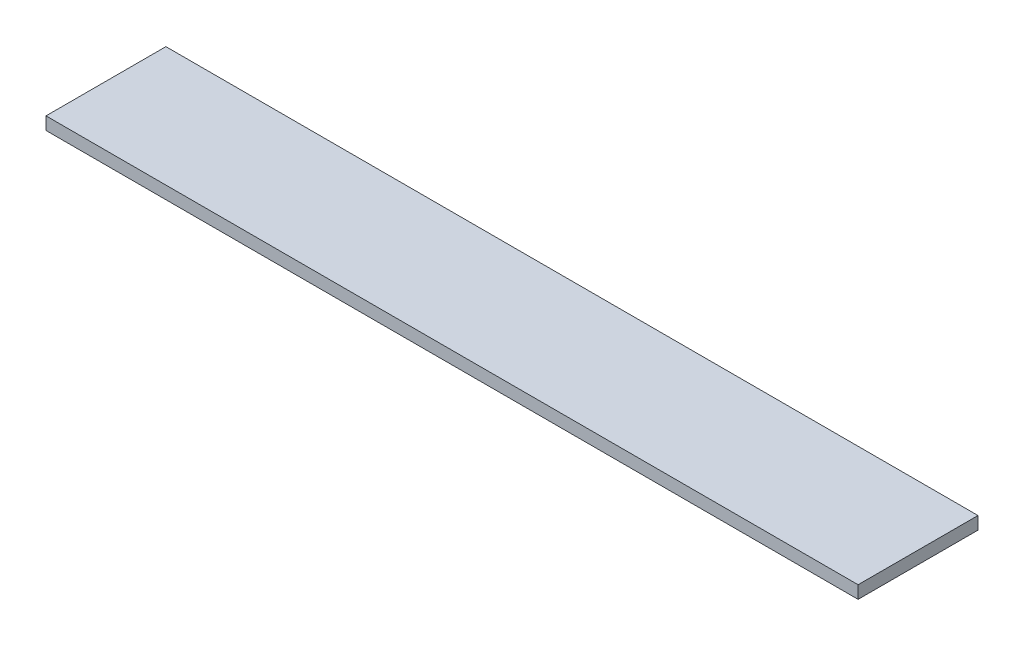
ISO-10303-21;
HEADER;
FILE_DESCRIPTION(('STEP AP214'),'2;1');
FILE_NAME('part.step','',(''),(''),'','','');
FILE_SCHEMA(('AUTOMOTIVE_DESIGN { 1 0 10303 214 1 1 1 1 }'));
ENDSEC;
DATA;
#1=APPLICATION_CONTEXT('core data for automotive mechanical design processes');
#2=APPLICATION_PROTOCOL_DEFINITION('international standard','automotive_design',2000,#1);
#3=PRODUCT_CONTEXT('',#1,'mechanical');
#4=PRODUCT('Part','Part','',(#3));
#5=PRODUCT_RELATED_PRODUCT_CATEGORY('part','',(#4));
#6=PRODUCT_DEFINITION_FORMATION('','',#4);
#7=PRODUCT_DEFINITION_CONTEXT('part definition',#1,'design');
#8=PRODUCT_DEFINITION('design','',#6,#7);
#9=PRODUCT_DEFINITION_SHAPE('','',#8);
#10=(LENGTH_UNIT() NAMED_UNIT(*) SI_UNIT(.MILLI.,.METRE.));
#11=(NAMED_UNIT(*) PLANE_ANGLE_UNIT() SI_UNIT($,.RADIAN.));
#12=(NAMED_UNIT(*) SI_UNIT($,.STERADIAN.) SOLID_ANGLE_UNIT());
#13=UNCERTAINTY_MEASURE_WITH_UNIT(LENGTH_MEASURE(1.E-05),#10,'distance_accuracy_value','');
#14=(GEOMETRIC_REPRESENTATION_CONTEXT(3) GLOBAL_UNCERTAINTY_ASSIGNED_CONTEXT((#13)) GLOBAL_UNIT_ASSIGNED_CONTEXT((#10,
#11,#12)) REPRESENTATION_CONTEXT('',''));
#15=CARTESIAN_POINT('',(0.,0.,0.));
#16=DIRECTION('',(0.,0.,1.));
#17=DIRECTION('',(1.,0.,0.));
#18=AXIS2_PLACEMENT_3D('',#15,#16,#17);
#19=CARTESIAN_POINT('',(0.,3.175,0.));
#20=DIRECTION('',(1.,0.,0.));
#21=DIRECTION('',(0.,0.,-1.));
#22=AXIS2_PLACEMENT_3D('',#19,#20,#21);
#23=PLANE('',#22);
#24=DIRECTION('',(0.,0.,1.));
#25=VECTOR('',#24,1.);
#26=CARTESIAN_POINT('',(0.,0.,0.));
#27=LINE('',#26,#25);
#28=CARTESIAN_POINT('',(0.,0.,-30.));
#29=VERTEX_POINT('',#28);
#30=CARTESIAN_POINT('',(0.,0.,0.));
#31=VERTEX_POINT('',#30);
#32=EDGE_CURVE('E96',#29,#31,#27,.T.);
#33=ORIENTED_EDGE('',*,*,#32,.T.);
#34=DIRECTION('',(0.,-1.,0.));
#35=VECTOR('',#34,1.);
#36=CARTESIAN_POINT('',(0.,3.175,0.));
#37=LINE('',#36,#35);
#38=CARTESIAN_POINT('',(0.,3.175,0.));
#39=VERTEX_POINT('',#38);
#40=EDGE_CURVE('E11',#39,#31,#37,.T.);
#41=ORIENTED_EDGE('',*,*,#40,.F.);
#42=DIRECTION('',(0.,0.,1.));
#43=VECTOR('',#42,1.);
#44=CARTESIAN_POINT('',(0.,3.175,0.));
#45=LINE('',#44,#43);
#46=CARTESIAN_POINT('',(0.,3.175,-30.));
#47=VERTEX_POINT('',#46);
#48=EDGE_CURVE('E84',#47,#39,#45,.T.);
#49=ORIENTED_EDGE('',*,*,#48,.F.);
#50=DIRECTION('',(0.,-1.,0.));
#51=VECTOR('',#50,1.);
#52=CARTESIAN_POINT('',(0.,3.175,-30.));
#53=LINE('',#52,#51);
#54=EDGE_CURVE('E92',#47,#29,#53,.T.);
#55=ORIENTED_EDGE('',*,*,#54,.T.);
#56=EDGE_LOOP('',(#33,#41,#49,#55));
#57=FACE_BOUND('',#56,.T.);
#58=ADVANCED_FACE('F33',(#57),#23,.F.);
#59=CARTESIAN_POINT('',(0.,3.175,0.));
#60=DIRECTION('',(0.,0.,-1.));
#61=DIRECTION('',(-1.,0.,0.));
#62=AXIS2_PLACEMENT_3D('',#59,#60,#61);
#63=PLANE('',#62);
#64=DIRECTION('',(1.,0.,0.));
#65=VECTOR('',#64,1.);
#66=CARTESIAN_POINT('',(0.,0.,0.));
#67=LINE('',#66,#65);
#68=CARTESIAN_POINT('',(203.2,0.,0.));
#69=VERTEX_POINT('',#68);
#70=EDGE_CURVE('E88',#31,#69,#67,.T.);
#71=ORIENTED_EDGE('',*,*,#70,.T.);
#72=DIRECTION('',(0.,-1.,0.));
#73=VECTOR('',#72,1.);
#74=CARTESIAN_POINT('',(203.2,3.175,0.));
#75=LINE('',#74,#73);
#76=CARTESIAN_POINT('',(203.2,3.175,0.));
#77=VERTEX_POINT('',#76);
#78=EDGE_CURVE('E41',#77,#69,#75,.T.);
#79=ORIENTED_EDGE('',*,*,#78,.F.);
#80=DIRECTION('',(1.,0.,0.));
#81=VECTOR('',#80,1.);
#82=CARTESIAN_POINT('',(0.,3.175,0.));
#83=LINE('',#82,#81);
#84=EDGE_CURVE('E79',#39,#77,#83,.T.);
#85=ORIENTED_EDGE('',*,*,#84,.F.);
#86=ORIENTED_EDGE('',*,*,#40,.T.);
#87=EDGE_LOOP('',(#71,#79,#85,#86));
#88=FACE_BOUND('',#87,.T.);
#89=ADVANCED_FACE('F87',(#88),#63,.F.);
#90=CARTESIAN_POINT('',(203.2,3.175,0.));
#91=DIRECTION('',(-1.,0.,0.));
#92=DIRECTION('',(0.,0.,1.));
#93=AXIS2_PLACEMENT_3D('',#90,#91,#92);
#94=PLANE('',#93);
#95=DIRECTION('',(0.,0.,-1.));
#96=VECTOR('',#95,1.);
#97=CARTESIAN_POINT('',(203.2,0.,0.));
#98=LINE('',#97,#96);
#99=CARTESIAN_POINT('',(203.2,0.,-30.));
#100=VERTEX_POINT('',#99);
#101=EDGE_CURVE('E66',#69,#100,#98,.T.);
#102=ORIENTED_EDGE('',*,*,#101,.T.);
#103=DIRECTION('',(0.,-1.,0.));
#104=VECTOR('',#103,1.);
#105=CARTESIAN_POINT('',(203.2,3.175,-30.));
#106=LINE('',#105,#104);
#107=CARTESIAN_POINT('',(203.2,3.175,-30.));
#108=VERTEX_POINT('',#107);
#109=EDGE_CURVE('E89',#108,#100,#106,.T.);
#110=ORIENTED_EDGE('',*,*,#109,.F.);
#111=DIRECTION('',(0.,0.,-1.));
#112=VECTOR('',#111,1.);
#113=CARTESIAN_POINT('',(203.2,3.175,0.));
#114=LINE('',#113,#112);
#115=EDGE_CURVE('E82',#77,#108,#114,.T.);
#116=ORIENTED_EDGE('',*,*,#115,.F.);
#117=ORIENTED_EDGE('',*,*,#78,.T.);
#118=EDGE_LOOP('',(#102,#110,#116,#117));
#119=FACE_BOUND('',#118,.T.);
#120=ADVANCED_FACE('F90',(#119),#94,.F.);
#121=CARTESIAN_POINT('',(0.,3.175,-30.));
#122=DIRECTION('',(0.,0.,1.));
#123=DIRECTION('',(1.,0.,0.));
#124=AXIS2_PLACEMENT_3D('',#121,#122,#123);
#125=PLANE('',#124);
#126=DIRECTION('',(-1.,0.,0.));
#127=VECTOR('',#126,1.);
#128=CARTESIAN_POINT('',(0.,0.,-30.));
#129=LINE('',#128,#127);
#130=EDGE_CURVE('E72',#100,#29,#129,.T.);
#131=ORIENTED_EDGE('',*,*,#130,.T.);
#132=ORIENTED_EDGE('',*,*,#54,.F.);
#133=DIRECTION('',(-1.,0.,0.));
#134=VECTOR('',#133,1.);
#135=CARTESIAN_POINT('',(0.,3.175,-30.));
#136=LINE('',#135,#134);
#137=EDGE_CURVE('E49',#108,#47,#136,.T.);
#138=ORIENTED_EDGE('',*,*,#137,.F.);
#139=ORIENTED_EDGE('',*,*,#109,.T.);
#140=EDGE_LOOP('',(#131,#132,#138,#139));
#141=FACE_BOUND('',#140,.T.);
#142=ADVANCED_FACE('F103',(#141),#125,.F.);
#143=CARTESIAN_POINT('',(0.,3.175,0.));
#144=DIRECTION('',(0.,-1.,0.));
#145=DIRECTION('',(0.,0.,-1.));
#146=AXIS2_PLACEMENT_3D('',#143,#144,#145);
#147=PLANE('',#146);
#148=ORIENTED_EDGE('',*,*,#48,.T.);
#149=ORIENTED_EDGE('',*,*,#84,.T.);
#150=ORIENTED_EDGE('',*,*,#115,.T.);
#151=ORIENTED_EDGE('',*,*,#137,.T.);
#152=EDGE_LOOP('',(#148,#149,#150,#151));
#153=FACE_BOUND('',#152,.T.);
#154=ADVANCED_FACE('F80',(#153),#147,.F.);
#155=CARTESIAN_POINT('',(0.,0.,0.));
#156=DIRECTION('',(0.,-1.,0.));
#157=DIRECTION('',(0.,0.,-1.));
#158=AXIS2_PLACEMENT_3D('',#155,#156,#157);
#159=PLANE('',#158);
#160=ORIENTED_EDGE('',*,*,#32,.F.);
#161=ORIENTED_EDGE('',*,*,#130,.F.);
#162=ORIENTED_EDGE('',*,*,#101,.F.);
#163=ORIENTED_EDGE('',*,*,#70,.F.);
#164=EDGE_LOOP('',(#160,#161,#162,#163));
#165=FACE_BOUND('',#164,.T.);
#166=ADVANCED_FACE('F106',(#165),#159,.T.);
#167=CLOSED_SHELL('',(#58,#89,#120,#142,#154,#166));
#168=MANIFOLD_SOLID_BREP('B2',#167);
#169=ADVANCED_BREP_SHAPE_REPRESENTATION('',(#18,#168),#14);
#170=SHAPE_DEFINITION_REPRESENTATION(#9,#169);
ENDSEC;
END-ISO-10303-21;
